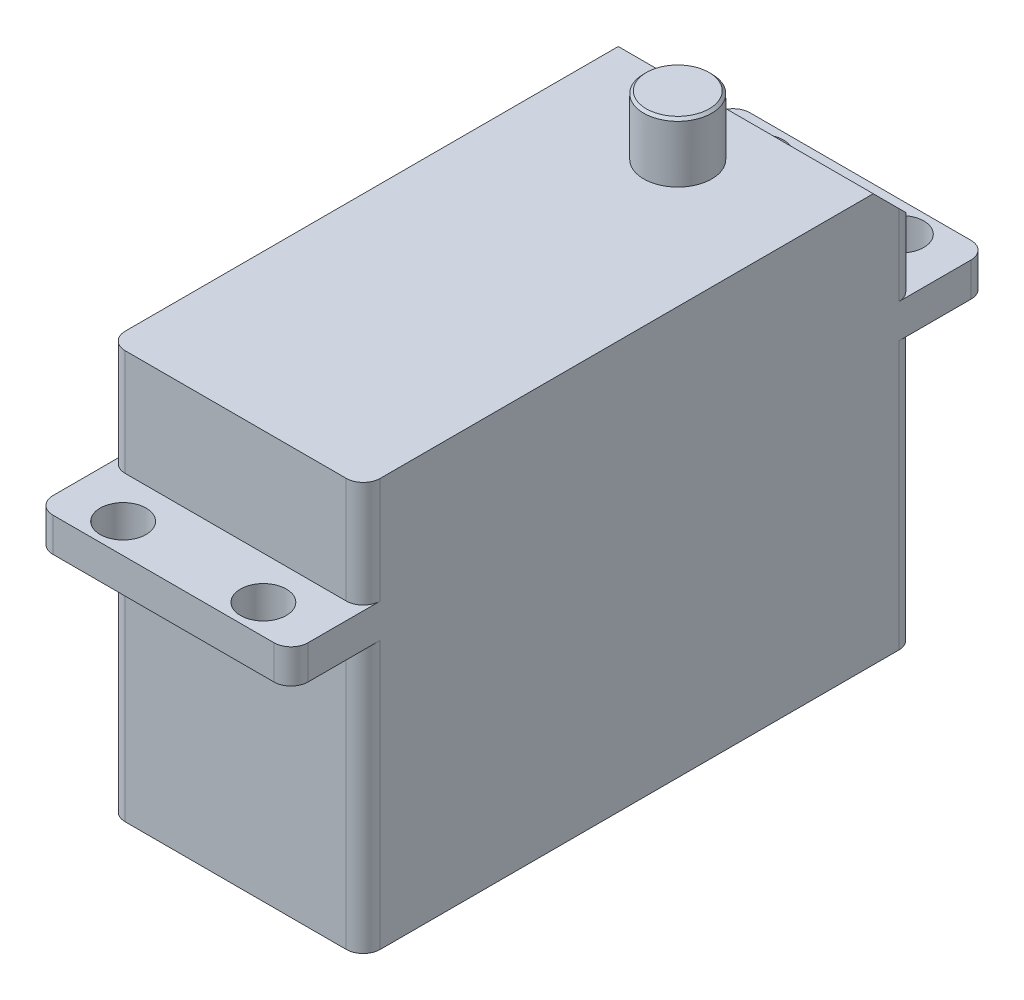
ISO-10303-21;
HEADER;
FILE_DESCRIPTION(('STEP AP214'),'2;1');
FILE_NAME('part.step','',(''),(''),'','','');
FILE_SCHEMA(('AUTOMOTIVE_DESIGN { 1 0 10303 214 1 1 1 1 }'));
ENDSEC;
DATA;
#1=APPLICATION_CONTEXT('core data for automotive mechanical design processes');
#2=APPLICATION_PROTOCOL_DEFINITION('international standard','automotive_design',2000,#1);
#3=PRODUCT_CONTEXT('',#1,'mechanical');
#4=PRODUCT('Part','Part','',(#3));
#5=PRODUCT_RELATED_PRODUCT_CATEGORY('part','',(#4));
#6=PRODUCT_DEFINITION_FORMATION('','',#4);
#7=PRODUCT_DEFINITION_CONTEXT('part definition',#1,'design');
#8=PRODUCT_DEFINITION('design','',#6,#7);
#9=PRODUCT_DEFINITION_SHAPE('','',#8);
#10=(LENGTH_UNIT() NAMED_UNIT(*) SI_UNIT(.MILLI.,.METRE.));
#11=(NAMED_UNIT(*) PLANE_ANGLE_UNIT() SI_UNIT($,.RADIAN.));
#12=(NAMED_UNIT(*) SI_UNIT($,.STERADIAN.) SOLID_ANGLE_UNIT());
#13=UNCERTAINTY_MEASURE_WITH_UNIT(LENGTH_MEASURE(1.E-05),#10,'distance_accuracy_value','');
#14=(GEOMETRIC_REPRESENTATION_CONTEXT(3) GLOBAL_UNCERTAINTY_ASSIGNED_CONTEXT((#13)) GLOBAL_UNIT_ASSIGNED_CONTEXT((#10,
#11,#12)) REPRESENTATION_CONTEXT('',''));
#15=CARTESIAN_POINT('',(0.,0.,0.));
#16=DIRECTION('',(0.,0.,1.));
#17=DIRECTION('',(1.,0.,0.));
#18=AXIS2_PLACEMENT_3D('',#15,#16,#17);
#19=CARTESIAN_POINT('',(-15.,48.,-32.5));
#20=DIRECTION('',(0.,0.,1.));
#21=DIRECTION('',(1.,0.,0.));
#22=AXIS2_PLACEMENT_3D('',#19,#20,#21);
#23=PLANE('',#22);
#24=DIRECTION('',(1.,0.,0.));
#25=VECTOR('',#24,1.);
#26=CARTESIAN_POINT('',(-15.,43.,-32.5));
#27=LINE('',#26,#25);
#28=CARTESIAN_POINT('',(-13.,43.,-32.5));
#29=VERTEX_POINT('',#28);
#30=CARTESIAN_POINT('',(13.,43.,-32.5));
#31=VERTEX_POINT('',#30);
#32=EDGE_CURVE('E287',#29,#31,#27,.T.);
#33=ORIENTED_EDGE('',*,*,#32,.T.);
#34=DIRECTION('',(0.,-1.,0.));
#35=VECTOR('',#34,1.);
#36=CARTESIAN_POINT('',(13.,48.,-32.5));
#37=LINE('',#36,#35);
#38=CARTESIAN_POINT('',(13.,35.5,-32.5));
#39=VERTEX_POINT('',#38);
#40=EDGE_CURVE('E332',#31,#39,#37,.T.);
#41=ORIENTED_EDGE('',*,*,#40,.T.);
#42=DIRECTION('',(1.,0.,0.));
#43=VECTOR('',#42,1.);
#44=CARTESIAN_POINT('',(-15.,35.5,-32.5));
#45=LINE('',#44,#43);
#46=CARTESIAN_POINT('',(-13.,35.5,-32.5));
#47=VERTEX_POINT('',#46);
#48=EDGE_CURVE('E345',#47,#39,#45,.T.);
#49=ORIENTED_EDGE('',*,*,#48,.F.);
#50=DIRECTION('',(0.,-1.,0.));
#51=VECTOR('',#50,1.);
#52=CARTESIAN_POINT('',(-13.,48.,-32.5));
#53=LINE('',#52,#51);
#54=EDGE_CURVE('E56',#47,#29,#53,.F.);
#55=ORIENTED_EDGE('',*,*,#54,.T.);
#56=EDGE_LOOP('',(#33,#41,#49,#55));
#57=FACE_BOUND('',#56,.T.);
#58=ADVANCED_FACE('F34',(#57),#23,.F.);
#59=CARTESIAN_POINT('',(-15.,48.,32.5));
#60=DIRECTION('',(0.,0.,-1.));
#61=DIRECTION('',(-1.,0.,0.));
#62=AXIS2_PLACEMENT_3D('',#59,#60,#61);
#63=PLANE('',#62);
#64=DIRECTION('',(-1.,0.,0.));
#65=VECTOR('',#64,1.);
#66=CARTESIAN_POINT('',(-15.,35.5,32.5));
#67=LINE('',#66,#65);
#68=CARTESIAN_POINT('',(13.,35.5,32.5));
#69=VERTEX_POINT('',#68);
#70=CARTESIAN_POINT('',(-13.,35.5,32.5));
#71=VERTEX_POINT('',#70);
#72=EDGE_CURVE('E358',#69,#71,#67,.T.);
#73=ORIENTED_EDGE('',*,*,#72,.F.);
#74=DIRECTION('',(0.,-1.,0.));
#75=VECTOR('',#74,1.);
#76=CARTESIAN_POINT('',(13.,48.,32.5));
#77=LINE('',#76,#75);
#78=CARTESIAN_POINT('',(13.,48.,32.5));
#79=VERTEX_POINT('',#78);
#80=EDGE_CURVE('E233',#69,#79,#77,.F.);
#81=ORIENTED_EDGE('',*,*,#80,.T.);
#82=DIRECTION('',(1.,0.,0.));
#83=VECTOR('',#82,1.);
#84=CARTESIAN_POINT('',(-15.,48.,32.5));
#85=LINE('',#84,#83);
#86=CARTESIAN_POINT('',(-13.,48.,32.5));
#87=VERTEX_POINT('',#86);
#88=EDGE_CURVE('E210',#87,#79,#85,.T.);
#89=ORIENTED_EDGE('',*,*,#88,.F.);
#90=DIRECTION('',(0.,-1.,0.));
#91=VECTOR('',#90,1.);
#92=CARTESIAN_POINT('',(-13.,48.,32.5));
#93=LINE('',#92,#91);
#94=EDGE_CURVE('E229',#87,#71,#93,.T.);
#95=ORIENTED_EDGE('',*,*,#94,.T.);
#96=EDGE_LOOP('',(#73,#81,#89,#95));
#97=FACE_BOUND('',#96,.T.);
#98=ADVANCED_FACE('F485',(#97),#63,.F.);
#99=CARTESIAN_POINT('',(15.,48.,32.5));
#100=DIRECTION('',(-1.,0.,0.));
#101=DIRECTION('',(0.,0.,1.));
#102=AXIS2_PLACEMENT_3D('',#99,#100,#101);
#103=PLANE('',#102);
#104=DIRECTION('',(0.,0.,1.));
#105=VECTOR('',#104,1.);
#106=CARTESIAN_POINT('',(15.,35.5,41.));
#107=LINE('',#106,#105);
#108=CARTESIAN_POINT('',(15.,35.5,30.5));
#109=VERTEX_POINT('',#108);
#110=CARTESIAN_POINT('',(15.,35.5,39.));
#111=VERTEX_POINT('',#110);
#112=EDGE_CURVE('E421',#109,#111,#107,.T.);
#113=ORIENTED_EDGE('',*,*,#112,.T.);
#114=DIRECTION('',(0.,1.,0.));
#115=VECTOR('',#114,1.);
#116=CARTESIAN_POINT('',(15.,48.,39.));
#117=LINE('',#116,#115);
#118=CARTESIAN_POINT('',(15.,31.5,39.));
#119=VERTEX_POINT('',#118);
#120=EDGE_CURVE('E316',#111,#119,#117,.F.);
#121=ORIENTED_EDGE('',*,*,#120,.T.);
#122=DIRECTION('',(0.,0.,1.));
#123=VECTOR('',#122,1.);
#124=CARTESIAN_POINT('',(15.,31.5,41.));
#125=LINE('',#124,#123);
#126=CARTESIAN_POINT('',(15.,31.5,30.5));
#127=VERTEX_POINT('',#126);
#128=EDGE_CURVE('E413',#127,#119,#125,.T.);
#129=ORIENTED_EDGE('',*,*,#128,.F.);
#130=DIRECTION('',(0.,-1.,0.));
#131=VECTOR('',#130,1.);
#132=CARTESIAN_POINT('',(15.,48.,30.5));
#133=LINE('',#132,#131);
#134=CARTESIAN_POINT('',(15.,0.,30.5));
#135=VERTEX_POINT('',#134);
#136=EDGE_CURVE('E230',#127,#135,#133,.T.);
#137=ORIENTED_EDGE('',*,*,#136,.T.);
#138=DIRECTION('',(0.,0.,-1.));
#139=VECTOR('',#138,1.);
#140=CARTESIAN_POINT('',(15.,0.,32.5));
#141=LINE('',#140,#139);
#142=CARTESIAN_POINT('',(15.,0.,-30.5));
#143=VERTEX_POINT('',#142);
#144=EDGE_CURVE('E362',#135,#143,#141,.T.);
#145=ORIENTED_EDGE('',*,*,#144,.T.);
#146=DIRECTION('',(0.,-1.,0.));
#147=VECTOR('',#146,1.);
#148=CARTESIAN_POINT('',(15.,48.,-30.5));
#149=LINE('',#148,#147);
#150=CARTESIAN_POINT('',(15.,31.5,-30.5));
#151=VERTEX_POINT('',#150);
#152=EDGE_CURVE('E236',#143,#151,#149,.F.);
#153=ORIENTED_EDGE('',*,*,#152,.T.);
#154=CARTESIAN_POINT('',(15.,31.5,-39.));
#155=VERTEX_POINT('',#154);
#156=EDGE_CURVE('E391',#155,#151,#125,.T.);
#157=ORIENTED_EDGE('',*,*,#156,.F.);
#158=DIRECTION('',(0.,1.,0.));
#159=VECTOR('',#158,1.);
#160=CARTESIAN_POINT('',(15.,48.,-39.));
#161=LINE('',#160,#159);
#162=CARTESIAN_POINT('',(15.,35.5,-39.));
#163=VERTEX_POINT('',#162);
#164=EDGE_CURVE('E313',#155,#163,#161,.T.);
#165=ORIENTED_EDGE('',*,*,#164,.T.);
#166=CARTESIAN_POINT('',(15.,35.5,-30.5));
#167=VERTEX_POINT('',#166);
#168=EDGE_CURVE('E344',#163,#167,#107,.T.);
#169=ORIENTED_EDGE('',*,*,#168,.T.);
#170=DIRECTION('',(0.,-1.,0.));
#171=VECTOR('',#170,1.);
#172=CARTESIAN_POINT('',(15.,48.,-30.5));
#173=LINE('',#172,#171);
#174=CARTESIAN_POINT('',(15.,45.,-30.5));
#175=VERTEX_POINT('',#174);
#176=EDGE_CURVE('E311',#167,#175,#173,.F.);
#177=ORIENTED_EDGE('',*,*,#176,.T.);
#178=DIRECTION('',(0.,-0.707106781186548,-0.707106781186547));
#179=VECTOR('',#178,1.);
#180=CARTESIAN_POINT('',(15.,48.,-27.5));
#181=LINE('',#180,#179);
#182=CARTESIAN_POINT('',(15.,48.,-27.5));
#183=VERTEX_POINT('',#182);
#184=EDGE_CURVE('E222',#175,#183,#181,.F.);
#185=ORIENTED_EDGE('',*,*,#184,.T.);
#186=DIRECTION('',(0.,0.,-1.));
#187=VECTOR('',#186,1.);
#188=CARTESIAN_POINT('',(15.,48.,32.5));
#189=LINE('',#188,#187);
#190=CARTESIAN_POINT('',(15.,48.,30.5));
#191=VERTEX_POINT('',#190);
#192=EDGE_CURVE('E207',#191,#183,#189,.T.);
#193=ORIENTED_EDGE('',*,*,#192,.F.);
#194=DIRECTION('',(0.,-1.,0.));
#195=VECTOR('',#194,1.);
#196=CARTESIAN_POINT('',(15.,48.,30.5));
#197=LINE('',#196,#195);
#198=EDGE_CURVE('E221',#191,#109,#197,.T.);
#199=ORIENTED_EDGE('',*,*,#198,.T.);
#200=EDGE_LOOP('',(#113,#121,#129,#137,#145,#153,#157,#165,#169,#177,#185,#193,#199));
#201=FACE_BOUND('',#200,.T.);
#202=ADVANCED_FACE('F220',(#201),#103,.F.);
#203=DIRECTION('',(1.,0.,0.));
#204=VECTOR('',#203,1.);
#205=CARTESIAN_POINT('',(-15.,31.5,-32.5));
#206=LINE('',#205,#204);
#207=CARTESIAN_POINT('',(-13.,31.5,-32.5));
#208=VERTEX_POINT('',#207);
#209=CARTESIAN_POINT('',(13.,31.5,-32.5));
#210=VERTEX_POINT('',#209);
#211=EDGE_CURVE('E366',#208,#210,#206,.T.);
#212=ORIENTED_EDGE('',*,*,#211,.T.);
#213=DIRECTION('',(0.,-1.,0.));
#214=VECTOR('',#213,1.);
#215=CARTESIAN_POINT('',(13.,48.,-32.5));
#216=LINE('',#215,#214);
#217=CARTESIAN_POINT('',(13.,0.,-32.5));
#218=VERTEX_POINT('',#217);
#219=EDGE_CURVE('E265',#210,#218,#216,.T.);
#220=ORIENTED_EDGE('',*,*,#219,.T.);
#221=DIRECTION('',(-1.,0.,0.));
#222=VECTOR('',#221,1.);
#223=CARTESIAN_POINT('',(-15.,0.,-32.5));
#224=LINE('',#223,#222);
#225=CARTESIAN_POINT('',(-13.,0.,-32.5));
#226=VERTEX_POINT('',#225);
#227=EDGE_CURVE('E365',#218,#226,#224,.T.);
#228=ORIENTED_EDGE('',*,*,#227,.T.);
#229=DIRECTION('',(0.,-1.,0.));
#230=VECTOR('',#229,1.);
#231=CARTESIAN_POINT('',(-13.,48.,-32.5));
#232=LINE('',#231,#230);
#233=EDGE_CURVE('E263',#226,#208,#232,.F.);
#234=ORIENTED_EDGE('',*,*,#233,.T.);
#235=EDGE_LOOP('',(#212,#220,#228,#234));
#236=FACE_BOUND('',#235,.T.);
#237=ADVANCED_FACE('F404',(#236),#23,.F.);
#238=CARTESIAN_POINT('',(-15.,48.,32.5));
#239=DIRECTION('',(1.,0.,0.));
#240=DIRECTION('',(0.,0.,-1.));
#241=AXIS2_PLACEMENT_3D('',#238,#239,#240);
#242=PLANE('',#241);
#243=DIRECTION('',(0.,0.,-1.));
#244=VECTOR('',#243,1.);
#245=CARTESIAN_POINT('',(-15.,31.5,41.));
#246=LINE('',#245,#244);
#247=CARTESIAN_POINT('',(-15.,31.5,39.));
#248=VERTEX_POINT('',#247);
#249=CARTESIAN_POINT('',(-15.,31.5,30.5));
#250=VERTEX_POINT('',#249);
#251=EDGE_CURVE('E424',#248,#250,#246,.T.);
#252=ORIENTED_EDGE('',*,*,#251,.F.);
#253=DIRECTION('',(0.,1.,0.));
#254=VECTOR('',#253,1.);
#255=CARTESIAN_POINT('',(-15.,48.,39.));
#256=LINE('',#255,#254);
#257=CARTESIAN_POINT('',(-15.,35.5,39.));
#258=VERTEX_POINT('',#257);
#259=EDGE_CURVE('E295',#248,#258,#256,.T.);
#260=ORIENTED_EDGE('',*,*,#259,.T.);
#261=DIRECTION('',(0.,0.,-1.));
#262=VECTOR('',#261,1.);
#263=CARTESIAN_POINT('',(-15.,35.5,41.));
#264=LINE('',#263,#262);
#265=CARTESIAN_POINT('',(-15.,35.5,30.5));
#266=VERTEX_POINT('',#265);
#267=EDGE_CURVE('E414',#258,#266,#264,.T.);
#268=ORIENTED_EDGE('',*,*,#267,.T.);
#269=DIRECTION('',(0.,-1.,0.));
#270=VECTOR('',#269,1.);
#271=CARTESIAN_POINT('',(-15.,48.,30.5));
#272=LINE('',#271,#270);
#273=CARTESIAN_POINT('',(-15.,48.,30.5));
#274=VERTEX_POINT('',#273);
#275=EDGE_CURVE('E247',#266,#274,#272,.F.);
#276=ORIENTED_EDGE('',*,*,#275,.T.);
#277=DIRECTION('',(0.,0.,1.));
#278=VECTOR('',#277,1.);
#279=CARTESIAN_POINT('',(-15.,48.,32.5));
#280=LINE('',#279,#278);
#281=CARTESIAN_POINT('',(-15.,48.,-27.5));
#282=VERTEX_POINT('',#281);
#283=EDGE_CURVE('E223',#282,#274,#280,.T.);
#284=ORIENTED_EDGE('',*,*,#283,.F.);
#285=DIRECTION('',(0.,0.707106781186548,0.707106781186547));
#286=VECTOR('',#285,1.);
#287=CARTESIAN_POINT('',(-15.,48.,-27.5));
#288=LINE('',#287,#286);
#289=CARTESIAN_POINT('',(-15.,45.,-30.5));
#290=VERTEX_POINT('',#289);
#291=EDGE_CURVE('E284',#282,#290,#288,.F.);
#292=ORIENTED_EDGE('',*,*,#291,.T.);
#293=DIRECTION('',(0.,-1.,0.));
#294=VECTOR('',#293,1.);
#295=CARTESIAN_POINT('',(-15.,48.,-30.5));
#296=LINE('',#295,#294);
#297=CARTESIAN_POINT('',(-15.,35.5,-30.5));
#298=VERTEX_POINT('',#297);
#299=EDGE_CURVE('E290',#290,#298,#296,.T.);
#300=ORIENTED_EDGE('',*,*,#299,.T.);
#301=CARTESIAN_POINT('',(-15.,35.5,-39.));
#302=VERTEX_POINT('',#301);
#303=EDGE_CURVE('E416',#298,#302,#264,.T.);
#304=ORIENTED_EDGE('',*,*,#303,.T.);
#305=DIRECTION('',(0.,1.,0.));
#306=VECTOR('',#305,1.);
#307=CARTESIAN_POINT('',(-15.,48.,-39.));
#308=LINE('',#307,#306);
#309=CARTESIAN_POINT('',(-15.,31.5,-39.));
#310=VERTEX_POINT('',#309);
#311=EDGE_CURVE('E293',#302,#310,#308,.F.);
#312=ORIENTED_EDGE('',*,*,#311,.T.);
#313=CARTESIAN_POINT('',(-15.,31.5,-30.5));
#314=VERTEX_POINT('',#313);
#315=EDGE_CURVE('E426',#314,#310,#246,.T.);
#316=ORIENTED_EDGE('',*,*,#315,.F.);
#317=DIRECTION('',(0.,-1.,0.));
#318=VECTOR('',#317,1.);
#319=CARTESIAN_POINT('',(-15.,48.,-30.5));
#320=LINE('',#319,#318);
#321=CARTESIAN_POINT('',(-15.,0.,-30.5));
#322=VERTEX_POINT('',#321);
#323=EDGE_CURVE('E214',#314,#322,#320,.T.);
#324=ORIENTED_EDGE('',*,*,#323,.T.);
#325=DIRECTION('',(0.,0.,1.));
#326=VECTOR('',#325,1.);
#327=CARTESIAN_POINT('',(-15.,0.,32.5));
#328=LINE('',#327,#326);
#329=CARTESIAN_POINT('',(-15.,0.,30.5));
#330=VERTEX_POINT('',#329);
#331=EDGE_CURVE('E369',#322,#330,#328,.T.);
#332=ORIENTED_EDGE('',*,*,#331,.T.);
#333=DIRECTION('',(0.,-1.,0.));
#334=VECTOR('',#333,1.);
#335=CARTESIAN_POINT('',(-15.,48.,30.5));
#336=LINE('',#335,#334);
#337=EDGE_CURVE('E244',#330,#250,#336,.F.);
#338=ORIENTED_EDGE('',*,*,#337,.T.);
#339=EDGE_LOOP('',(#252,#260,#268,#276,#284,#292,#300,#304,#312,#316,#324,#332,#338));
#340=FACE_BOUND('',#339,.T.);
#341=ADVANCED_FACE('F353',(#340),#242,.F.);
#342=DIRECTION('',(-1.,0.,0.));
#343=VECTOR('',#342,1.);
#344=CARTESIAN_POINT('',(-15.,31.5,32.5));
#345=LINE('',#344,#343);
#346=CARTESIAN_POINT('',(13.,31.5,32.5));
#347=VERTEX_POINT('',#346);
#348=CARTESIAN_POINT('',(-13.,31.5,32.5));
#349=VERTEX_POINT('',#348);
#350=EDGE_CURVE('E376',#347,#349,#345,.T.);
#351=ORIENTED_EDGE('',*,*,#350,.T.);
#352=DIRECTION('',(0.,-1.,0.));
#353=VECTOR('',#352,1.);
#354=CARTESIAN_POINT('',(-13.,48.,32.5));
#355=LINE('',#354,#353);
#356=CARTESIAN_POINT('',(-13.,0.,32.5));
#357=VERTEX_POINT('',#356);
#358=EDGE_CURVE('E252',#349,#357,#355,.T.);
#359=ORIENTED_EDGE('',*,*,#358,.T.);
#360=DIRECTION('',(1.,0.,0.));
#361=VECTOR('',#360,1.);
#362=CARTESIAN_POINT('',(-15.,0.,32.5));
#363=LINE('',#362,#361);
#364=CARTESIAN_POINT('',(13.,0.,32.5));
#365=VERTEX_POINT('',#364);
#366=EDGE_CURVE('E224',#357,#365,#363,.T.);
#367=ORIENTED_EDGE('',*,*,#366,.T.);
#368=DIRECTION('',(0.,-1.,0.));
#369=VECTOR('',#368,1.);
#370=CARTESIAN_POINT('',(13.,48.,32.5));
#371=LINE('',#370,#369);
#372=EDGE_CURVE('E250',#365,#347,#371,.F.);
#373=ORIENTED_EDGE('',*,*,#372,.T.);
#374=EDGE_LOOP('',(#351,#359,#367,#373));
#375=FACE_BOUND('',#374,.T.);
#376=ADVANCED_FACE('F492',(#375),#63,.F.);
#377=CARTESIAN_POINT('',(0.,48.,0.));
#378=DIRECTION('',(0.,-1.,0.));
#379=DIRECTION('',(0.,0.,-1.));
#380=AXIS2_PLACEMENT_3D('',#377,#378,#379);
#381=PLANE('',#380);
#382=CARTESIAN_POINT('',(0.,48.,-19.5));
#383=DIRECTION('',(0.,-1.,0.));
#384=DIRECTION('',(0.,0.,-1.));
#385=AXIS2_PLACEMENT_3D('',#382,#383,#384);
#386=CIRCLE('',#385,4.);
#387=CARTESIAN_POINT('',(0.,48.,-23.5));
#388=VERTEX_POINT('',#387);
#389=EDGE_CURVE('E379',#388,#388,#386,.F.);
#390=ORIENTED_EDGE('',*,*,#389,.F.);
#391=EDGE_LOOP('',(#390));
#392=FACE_BOUND('',#391,.T.);
#393=ORIENTED_EDGE('',*,*,#192,.T.);
#394=DIRECTION('',(-1.,0.,0.));
#395=VECTOR('',#394,1.);
#396=CARTESIAN_POINT('',(0.,48.,-27.5));
#397=LINE('',#396,#395);
#398=EDGE_CURVE('E282',#183,#282,#397,.T.);
#399=ORIENTED_EDGE('',*,*,#398,.T.);
#400=ORIENTED_EDGE('',*,*,#283,.T.);
#401=CARTESIAN_POINT('',(-13.,48.,30.5));
#402=DIRECTION('',(0.,-1.,0.));
#403=DIRECTION('',(0.,0.,-1.));
#404=AXIS2_PLACEMENT_3D('',#401,#402,#403);
#405=CIRCLE('',#404,2.);
#406=EDGE_CURVE('E215',#274,#87,#405,.F.);
#407=ORIENTED_EDGE('',*,*,#406,.T.);
#408=ORIENTED_EDGE('',*,*,#88,.T.);
#409=CARTESIAN_POINT('',(13.,48.,30.5));
#410=DIRECTION('',(0.,-1.,0.));
#411=DIRECTION('',(0.,0.,-1.));
#412=AXIS2_PLACEMENT_3D('',#409,#410,#411);
#413=CIRCLE('',#412,2.);
#414=EDGE_CURVE('E203',#79,#191,#413,.F.);
#415=ORIENTED_EDGE('',*,*,#414,.T.);
#416=EDGE_LOOP('',(#393,#399,#400,#407,#408,#415));
#417=FACE_BOUND('',#416,.T.);
#418=ADVANCED_FACE('F205',(#392,#417),#381,.F.);
#419=CARTESIAN_POINT('',(0.,0.,0.));
#420=DIRECTION('',(0.,-1.,0.));
#421=DIRECTION('',(0.,0.,-1.));
#422=AXIS2_PLACEMENT_3D('',#419,#420,#421);
#423=PLANE('',#422);
#424=ORIENTED_EDGE('',*,*,#366,.F.);
#425=CARTESIAN_POINT('',(-13.,0.,30.5));
#426=DIRECTION('',(0.,-1.,0.));
#427=DIRECTION('',(0.,0.,-1.));
#428=AXIS2_PLACEMENT_3D('',#425,#426,#427);
#429=CIRCLE('',#428,2.);
#430=EDGE_CURVE('E261',#357,#330,#429,.T.);
#431=ORIENTED_EDGE('',*,*,#430,.T.);
#432=ORIENTED_EDGE('',*,*,#331,.F.);
#433=CARTESIAN_POINT('',(-13.,0.,-30.5));
#434=DIRECTION('',(0.,-1.,0.));
#435=DIRECTION('',(0.,0.,-1.));
#436=AXIS2_PLACEMENT_3D('',#433,#434,#435);
#437=CIRCLE('',#436,2.);
#438=EDGE_CURVE('E255',#322,#226,#437,.T.);
#439=ORIENTED_EDGE('',*,*,#438,.T.);
#440=ORIENTED_EDGE('',*,*,#227,.F.);
#441=CARTESIAN_POINT('',(13.,0.,-30.5));
#442=DIRECTION('',(0.,-1.,0.));
#443=DIRECTION('',(0.,0.,-1.));
#444=AXIS2_PLACEMENT_3D('',#441,#442,#443);
#445=CIRCLE('',#444,2.);
#446=EDGE_CURVE('E257',#218,#143,#445,.T.);
#447=ORIENTED_EDGE('',*,*,#446,.T.);
#448=ORIENTED_EDGE('',*,*,#144,.F.);
#449=CARTESIAN_POINT('',(13.,0.,30.5));
#450=DIRECTION('',(0.,-1.,0.));
#451=DIRECTION('',(0.,0.,-1.));
#452=AXIS2_PLACEMENT_3D('',#449,#450,#451);
#453=CIRCLE('',#452,2.);
#454=EDGE_CURVE('E259',#135,#365,#453,.T.);
#455=ORIENTED_EDGE('',*,*,#454,.T.);
#456=EDGE_LOOP('',(#424,#431,#432,#439,#440,#447,#448,#455));
#457=FACE_BOUND('',#456,.T.);
#458=ADVANCED_FACE('F566',(#457),#423,.T.);
#459=CARTESIAN_POINT('',(-15.,31.5,41.));
#460=DIRECTION('',(0.,0.,-1.));
#461=DIRECTION('',(-1.,0.,0.));
#462=AXIS2_PLACEMENT_3D('',#459,#460,#461);
#463=PLANE('',#462);
#464=DIRECTION('',(-1.,0.,0.));
#465=VECTOR('',#464,1.);
#466=CARTESIAN_POINT('',(-15.,35.5,41.));
#467=LINE('',#466,#465);
#468=CARTESIAN_POINT('',(13.,35.5,41.));
#469=VERTEX_POINT('',#468);
#470=CARTESIAN_POINT('',(-13.,35.5,41.));
#471=VERTEX_POINT('',#470);
#472=EDGE_CURVE('E417',#469,#471,#467,.T.);
#473=ORIENTED_EDGE('',*,*,#472,.T.);
#474=DIRECTION('',(0.,1.,0.));
#475=VECTOR('',#474,1.);
#476=CARTESIAN_POINT('',(-13.,31.5,41.));
#477=LINE('',#476,#475);
#478=CARTESIAN_POINT('',(-13.,31.5,41.));
#479=VERTEX_POINT('',#478);
#480=EDGE_CURVE('E305',#471,#479,#477,.F.);
#481=ORIENTED_EDGE('',*,*,#480,.T.);
#482=DIRECTION('',(-1.,0.,0.));
#483=VECTOR('',#482,1.);
#484=CARTESIAN_POINT('',(-15.,31.5,41.));
#485=LINE('',#484,#483);
#486=CARTESIAN_POINT('',(13.,31.5,41.));
#487=VERTEX_POINT('',#486);
#488=EDGE_CURVE('E427',#487,#479,#485,.T.);
#489=ORIENTED_EDGE('',*,*,#488,.F.);
#490=DIRECTION('',(0.,1.,0.));
#491=VECTOR('',#490,1.);
#492=CARTESIAN_POINT('',(13.,31.5,41.));
#493=LINE('',#492,#491);
#494=EDGE_CURVE('E302',#487,#469,#493,.T.);
#495=ORIENTED_EDGE('',*,*,#494,.T.);
#496=EDGE_LOOP('',(#473,#481,#489,#495));
#497=FACE_BOUND('',#496,.T.);
#498=ADVANCED_FACE('F583',(#497),#463,.F.);
#499=CARTESIAN_POINT('',(0.,31.5,0.));
#500=DIRECTION('',(0.,-1.,0.));
#501=DIRECTION('',(0.,0.,-1.));
#502=AXIS2_PLACEMENT_3D('',#499,#500,#501);
#503=PLANE('',#502);
#504=CARTESIAN_POINT('',(-8.25,31.5,37.5));
#505=DIRECTION('',(0.,1.,0.));
#506=DIRECTION('',(0.,0.,1.));
#507=AXIS2_PLACEMENT_3D('',#504,#505,#506);
#508=CIRCLE('',#507,2.7);
#509=CARTESIAN_POINT('',(-8.25,31.5,40.2));
#510=VERTEX_POINT('',#509);
#511=EDGE_CURVE('E441',#510,#510,#508,.T.);
#512=ORIENTED_EDGE('',*,*,#511,.T.);
#513=EDGE_LOOP('',(#512));
#514=FACE_BOUND('',#513,.T.);
#515=CARTESIAN_POINT('',(8.25,31.5,37.5));
#516=DIRECTION('',(0.,1.,0.));
#517=DIRECTION('',(0.,0.,1.));
#518=AXIS2_PLACEMENT_3D('',#515,#516,#517);
#519=CIRCLE('',#518,2.7);
#520=CARTESIAN_POINT('',(8.25,31.5,40.2));
#521=VERTEX_POINT('',#520);
#522=EDGE_CURVE('E447',#521,#521,#519,.T.);
#523=ORIENTED_EDGE('',*,*,#522,.T.);
#524=EDGE_LOOP('',(#523));
#525=FACE_BOUND('',#524,.T.);
#526=ORIENTED_EDGE('',*,*,#488,.T.);
#527=CARTESIAN_POINT('',(-13.,31.5,39.));
#528=DIRECTION('',(0.,-1.,0.));
#529=DIRECTION('',(0.,0.,-1.));
#530=AXIS2_PLACEMENT_3D('',#527,#528,#529);
#531=CIRCLE('',#530,2.);
#532=EDGE_CURVE('E309',#479,#248,#531,.T.);
#533=ORIENTED_EDGE('',*,*,#532,.T.);
#534=ORIENTED_EDGE('',*,*,#251,.T.);
#535=CARTESIAN_POINT('',(-13.,31.5,30.5));
#536=DIRECTION('',(0.,-1.,0.));
#537=DIRECTION('',(0.,0.,-1.));
#538=AXIS2_PLACEMENT_3D('',#535,#536,#537);
#539=CIRCLE('',#538,2.);
#540=EDGE_CURVE('E272',#250,#349,#539,.F.);
#541=ORIENTED_EDGE('',*,*,#540,.T.);
#542=ORIENTED_EDGE('',*,*,#350,.F.);
#543=CARTESIAN_POINT('',(13.,31.5,30.5));
#544=DIRECTION('',(0.,-1.,0.));
#545=DIRECTION('',(0.,0.,-1.));
#546=AXIS2_PLACEMENT_3D('',#543,#544,#545);
#547=CIRCLE('',#546,2.);
#548=EDGE_CURVE('E274',#347,#127,#547,.F.);
#549=ORIENTED_EDGE('',*,*,#548,.T.);
#550=ORIENTED_EDGE('',*,*,#128,.T.);
#551=CARTESIAN_POINT('',(13.,31.5,39.));
#552=DIRECTION('',(0.,-1.,0.));
#553=DIRECTION('',(0.,0.,-1.));
#554=AXIS2_PLACEMENT_3D('',#551,#552,#553);
#555=CIRCLE('',#554,2.);
#556=EDGE_CURVE('E307',#119,#487,#555,.T.);
#557=ORIENTED_EDGE('',*,*,#556,.T.);
#558=EDGE_LOOP('',(#526,#533,#534,#541,#542,#549,#550,#557));
#559=FACE_BOUND('',#558,.T.);
#560=ADVANCED_FACE('F574',(#514,#525,#559),#503,.T.);
#561=CARTESIAN_POINT('',(0.,35.5,0.));
#562=DIRECTION('',(0.,-1.,0.));
#563=DIRECTION('',(0.,0.,-1.));
#564=AXIS2_PLACEMENT_3D('',#561,#562,#563);
#565=PLANE('',#564);
#566=CARTESIAN_POINT('',(-8.25,35.5,37.5));
#567=DIRECTION('',(0.,1.,0.));
#568=DIRECTION('',(0.,0.,1.));
#569=AXIS2_PLACEMENT_3D('',#566,#567,#568);
#570=CIRCLE('',#569,2.7);
#571=CARTESIAN_POINT('',(-8.25,35.5,40.2));
#572=VERTEX_POINT('',#571);
#573=EDGE_CURVE('E438',#572,#572,#570,.T.);
#574=ORIENTED_EDGE('',*,*,#573,.F.);
#575=EDGE_LOOP('',(#574));
#576=FACE_BOUND('',#575,.T.);
#577=CARTESIAN_POINT('',(8.25,35.5,37.5));
#578=DIRECTION('',(0.,1.,0.));
#579=DIRECTION('',(0.,0.,1.));
#580=AXIS2_PLACEMENT_3D('',#577,#578,#579);
#581=CIRCLE('',#580,2.7);
#582=CARTESIAN_POINT('',(8.25,35.5,40.2));
#583=VERTEX_POINT('',#582);
#584=EDGE_CURVE('E444',#583,#583,#581,.T.);
#585=ORIENTED_EDGE('',*,*,#584,.F.);
#586=EDGE_LOOP('',(#585));
#587=FACE_BOUND('',#586,.T.);
#588=ORIENTED_EDGE('',*,*,#267,.F.);
#589=CARTESIAN_POINT('',(-13.,35.5,39.));
#590=DIRECTION('',(0.,-1.,0.));
#591=DIRECTION('',(0.,0.,-1.));
#592=AXIS2_PLACEMENT_3D('',#589,#590,#591);
#593=CIRCLE('',#592,2.);
#594=EDGE_CURVE('E300',#258,#471,#593,.F.);
#595=ORIENTED_EDGE('',*,*,#594,.T.);
#596=ORIENTED_EDGE('',*,*,#472,.F.);
#597=CARTESIAN_POINT('',(13.,35.5,39.));
#598=DIRECTION('',(0.,-1.,0.));
#599=DIRECTION('',(0.,0.,-1.));
#600=AXIS2_PLACEMENT_3D('',#597,#598,#599);
#601=CIRCLE('',#600,2.);
#602=EDGE_CURVE('E298',#469,#111,#601,.F.);
#603=ORIENTED_EDGE('',*,*,#602,.T.);
#604=ORIENTED_EDGE('',*,*,#112,.F.);
#605=CARTESIAN_POINT('',(13.,35.5,30.5));
#606=DIRECTION('',(0.,-1.,0.));
#607=DIRECTION('',(0.,0.,-1.));
#608=AXIS2_PLACEMENT_3D('',#605,#606,#607);
#609=CIRCLE('',#608,2.);
#610=EDGE_CURVE('E228',#109,#69,#609,.T.);
#611=ORIENTED_EDGE('',*,*,#610,.T.);
#612=ORIENTED_EDGE('',*,*,#72,.T.);
#613=CARTESIAN_POINT('',(-13.,35.5,30.5));
#614=DIRECTION('',(0.,-1.,0.));
#615=DIRECTION('',(0.,0.,-1.));
#616=AXIS2_PLACEMENT_3D('',#613,#614,#615);
#617=CIRCLE('',#616,2.);
#618=EDGE_CURVE('E269',#71,#266,#617,.T.);
#619=ORIENTED_EDGE('',*,*,#618,.T.);
#620=EDGE_LOOP('',(#588,#595,#596,#603,#604,#611,#612,#619));
#621=FACE_BOUND('',#620,.T.);
#622=ADVANCED_FACE('F470',(#576,#587,#621),#565,.F.);
#623=CARTESIAN_POINT('',(8.25,31.5,-37.5));
#624=DIRECTION('',(0.,1.,0.));
#625=DIRECTION('',(0.,0.,1.));
#626=AXIS2_PLACEMENT_3D('',#623,#624,#625);
#627=CIRCLE('',#626,2.7);
#628=CARTESIAN_POINT('',(8.25,31.5,-34.8));
#629=VERTEX_POINT('',#628);
#630=EDGE_CURVE('E435',#629,#629,#627,.T.);
#631=ORIENTED_EDGE('',*,*,#630,.T.);
#632=EDGE_LOOP('',(#631));
#633=FACE_BOUND('',#632,.T.);
#634=CARTESIAN_POINT('',(-8.25,31.5,-37.5));
#635=DIRECTION('',(0.,1.,0.));
#636=DIRECTION('',(0.,0.,1.));
#637=AXIS2_PLACEMENT_3D('',#634,#635,#636);
#638=CIRCLE('',#637,2.7);
#639=CARTESIAN_POINT('',(-8.25,31.5,-34.8));
#640=VERTEX_POINT('',#639);
#641=EDGE_CURVE('E434',#640,#640,#638,.T.);
#642=ORIENTED_EDGE('',*,*,#641,.T.);
#643=EDGE_LOOP('',(#642));
#644=FACE_BOUND('',#643,.T.);
#645=ORIENTED_EDGE('',*,*,#315,.T.);
#646=CARTESIAN_POINT('',(-13.,31.5,-39.));
#647=DIRECTION('',(0.,-1.,0.));
#648=DIRECTION('',(0.,0.,-1.));
#649=AXIS2_PLACEMENT_3D('',#646,#647,#648);
#650=CIRCLE('',#649,2.);
#651=CARTESIAN_POINT('',(-13.,31.5,-41.));
#652=VERTEX_POINT('',#651);
#653=EDGE_CURVE('E329',#310,#652,#650,.T.);
#654=ORIENTED_EDGE('',*,*,#653,.T.);
#655=DIRECTION('',(1.,0.,0.));
#656=VECTOR('',#655,1.);
#657=CARTESIAN_POINT('',(-15.,31.5,-41.));
#658=LINE('',#657,#656);
#659=CARTESIAN_POINT('',(13.,31.5,-41.));
#660=VERTEX_POINT('',#659);
#661=EDGE_CURVE('E407',#652,#660,#658,.T.);
#662=ORIENTED_EDGE('',*,*,#661,.T.);
#663=CARTESIAN_POINT('',(13.,31.5,-39.));
#664=DIRECTION('',(0.,-1.,0.));
#665=DIRECTION('',(0.,0.,-1.));
#666=AXIS2_PLACEMENT_3D('',#663,#664,#665);
#667=CIRCLE('',#666,2.);
#668=EDGE_CURVE('E327',#660,#155,#667,.T.);
#669=ORIENTED_EDGE('',*,*,#668,.T.);
#670=ORIENTED_EDGE('',*,*,#156,.T.);
#671=CARTESIAN_POINT('',(13.,31.5,-30.5));
#672=DIRECTION('',(0.,-1.,0.));
#673=DIRECTION('',(0.,0.,-1.));
#674=AXIS2_PLACEMENT_3D('',#671,#672,#673);
#675=CIRCLE('',#674,2.);
#676=EDGE_CURVE('E277',#151,#210,#675,.F.);
#677=ORIENTED_EDGE('',*,*,#676,.T.);
#678=ORIENTED_EDGE('',*,*,#211,.F.);
#679=CARTESIAN_POINT('',(-13.,31.5,-30.5));
#680=DIRECTION('',(0.,-1.,0.));
#681=DIRECTION('',(0.,0.,-1.));
#682=AXIS2_PLACEMENT_3D('',#679,#680,#681);
#683=CIRCLE('',#682,2.);
#684=EDGE_CURVE('E279',#208,#314,#683,.F.);
#685=ORIENTED_EDGE('',*,*,#684,.T.);
#686=EDGE_LOOP('',(#645,#654,#662,#669,#670,#677,#678,#685));
#687=FACE_BOUND('',#686,.T.);
#688=ADVANCED_FACE('F401',(#633,#644,#687),#503,.T.);
#689=CARTESIAN_POINT('',(8.25,35.5,-37.5));
#690=DIRECTION('',(0.,1.,0.));
#691=DIRECTION('',(0.,0.,1.));
#692=AXIS2_PLACEMENT_3D('',#689,#690,#691);
#693=CIRCLE('',#692,2.7);
#694=CARTESIAN_POINT('',(8.25,35.5,-34.8));
#695=VERTEX_POINT('',#694);
#696=EDGE_CURVE('E450',#695,#695,#693,.T.);
#697=ORIENTED_EDGE('',*,*,#696,.F.);
#698=EDGE_LOOP('',(#697));
#699=FACE_BOUND('',#698,.T.);
#700=CARTESIAN_POINT('',(-8.25,35.5,-37.5));
#701=DIRECTION('',(0.,1.,0.));
#702=DIRECTION('',(0.,0.,1.));
#703=AXIS2_PLACEMENT_3D('',#700,#701,#702);
#704=CIRCLE('',#703,2.7);
#705=CARTESIAN_POINT('',(-8.25,35.5,-34.8));
#706=VERTEX_POINT('',#705);
#707=EDGE_CURVE('E431',#706,#706,#704,.T.);
#708=ORIENTED_EDGE('',*,*,#707,.F.);
#709=EDGE_LOOP('',(#708));
#710=FACE_BOUND('',#709,.T.);
#711=DIRECTION('',(1.,0.,0.));
#712=VECTOR('',#711,1.);
#713=CARTESIAN_POINT('',(-15.,35.5,-41.));
#714=LINE('',#713,#712);
#715=CARTESIAN_POINT('',(-13.,35.5,-41.));
#716=VERTEX_POINT('',#715);
#717=CARTESIAN_POINT('',(13.,35.5,-41.));
#718=VERTEX_POINT('',#717);
#719=EDGE_CURVE('E410',#716,#718,#714,.T.);
#720=ORIENTED_EDGE('',*,*,#719,.F.);
#721=CARTESIAN_POINT('',(-13.,35.5,-39.));
#722=DIRECTION('',(0.,-1.,0.));
#723=DIRECTION('',(0.,0.,-1.));
#724=AXIS2_PLACEMENT_3D('',#721,#722,#723);
#725=CIRCLE('',#724,2.);
#726=EDGE_CURVE('E325',#716,#302,#725,.F.);
#727=ORIENTED_EDGE('',*,*,#726,.T.);
#728=ORIENTED_EDGE('',*,*,#303,.F.);
#729=CARTESIAN_POINT('',(-13.,35.5,-30.5));
#730=DIRECTION('',(0.,-1.,0.));
#731=DIRECTION('',(0.,0.,-1.));
#732=AXIS2_PLACEMENT_3D('',#729,#730,#731);
#733=CIRCLE('',#732,2.);
#734=EDGE_CURVE('E11',#298,#47,#733,.T.);
#735=ORIENTED_EDGE('',*,*,#734,.T.);
#736=ORIENTED_EDGE('',*,*,#48,.T.);
#737=CARTESIAN_POINT('',(13.,35.5,-30.5));
#738=DIRECTION('',(0.,-1.,0.));
#739=DIRECTION('',(0.,0.,-1.));
#740=AXIS2_PLACEMENT_3D('',#737,#738,#739);
#741=CIRCLE('',#740,2.);
#742=EDGE_CURVE('E42',#39,#167,#741,.T.);
#743=ORIENTED_EDGE('',*,*,#742,.T.);
#744=ORIENTED_EDGE('',*,*,#168,.F.);
#745=CARTESIAN_POINT('',(13.,35.5,-39.));
#746=DIRECTION('',(0.,-1.,0.));
#747=DIRECTION('',(0.,0.,-1.));
#748=AXIS2_PLACEMENT_3D('',#745,#746,#747);
#749=CIRCLE('',#748,2.);
#750=EDGE_CURVE('E323',#163,#718,#749,.F.);
#751=ORIENTED_EDGE('',*,*,#750,.T.);
#752=EDGE_LOOP('',(#720,#727,#728,#735,#736,#743,#744,#751));
#753=FACE_BOUND('',#752,.T.);
#754=ADVANCED_FACE('F343',(#699,#710,#753),#565,.F.);
#755=CARTESIAN_POINT('',(-15.,31.5,-41.));
#756=DIRECTION('',(0.,0.,1.));
#757=DIRECTION('',(1.,0.,0.));
#758=AXIS2_PLACEMENT_3D('',#755,#756,#757);
#759=PLANE('',#758);
#760=ORIENTED_EDGE('',*,*,#661,.F.);
#761=DIRECTION('',(0.,1.,0.));
#762=VECTOR('',#761,1.);
#763=CARTESIAN_POINT('',(-13.,31.5,-41.));
#764=LINE('',#763,#762);
#765=EDGE_CURVE('E320',#652,#716,#764,.T.);
#766=ORIENTED_EDGE('',*,*,#765,.T.);
#767=ORIENTED_EDGE('',*,*,#719,.T.);
#768=DIRECTION('',(0.,1.,0.));
#769=VECTOR('',#768,1.);
#770=CARTESIAN_POINT('',(13.,31.5,-41.));
#771=LINE('',#770,#769);
#772=EDGE_CURVE('E318',#718,#660,#771,.F.);
#773=ORIENTED_EDGE('',*,*,#772,.T.);
#774=EDGE_LOOP('',(#760,#766,#767,#773));
#775=FACE_BOUND('',#774,.T.);
#776=ADVANCED_FACE('F468',(#775),#759,.F.);
#777=CARTESIAN_POINT('',(-8.25,31.5,-37.5));
#778=DIRECTION('',(0.,1.,0.));
#779=DIRECTION('',(0.,0.,1.));
#780=AXIS2_PLACEMENT_3D('',#777,#778,#779);
#781=CYLINDRICAL_SURFACE('',#780,2.7);
#782=ORIENTED_EDGE('',*,*,#641,.F.);
#783=EDGE_LOOP('',(#782));
#784=FACE_BOUND('',#783,.T.);
#785=ORIENTED_EDGE('',*,*,#707,.T.);
#786=EDGE_LOOP('',(#785));
#787=FACE_BOUND('',#786,.T.);
#788=ADVANCED_FACE('F462',(#784,#787),#781,.F.);
#789=CARTESIAN_POINT('',(8.25,31.5,-37.5));
#790=DIRECTION('',(0.,1.,0.));
#791=DIRECTION('',(0.,0.,1.));
#792=AXIS2_PLACEMENT_3D('',#789,#790,#791);
#793=CYLINDRICAL_SURFACE('',#792,2.7);
#794=ORIENTED_EDGE('',*,*,#630,.F.);
#795=EDGE_LOOP('',(#794));
#796=FACE_BOUND('',#795,.T.);
#797=ORIENTED_EDGE('',*,*,#696,.T.);
#798=EDGE_LOOP('',(#797));
#799=FACE_BOUND('',#798,.T.);
#800=ADVANCED_FACE('F458',(#796,#799),#793,.F.);
#801=CARTESIAN_POINT('',(8.25,31.5,37.5));
#802=DIRECTION('',(0.,1.,0.));
#803=DIRECTION('',(0.,0.,1.));
#804=AXIS2_PLACEMENT_3D('',#801,#802,#803);
#805=CYLINDRICAL_SURFACE('',#804,2.7);
#806=ORIENTED_EDGE('',*,*,#522,.F.);
#807=EDGE_LOOP('',(#806));
#808=FACE_BOUND('',#807,.T.);
#809=ORIENTED_EDGE('',*,*,#584,.T.);
#810=EDGE_LOOP('',(#809));
#811=FACE_BOUND('',#810,.T.);
#812=ADVANCED_FACE('F461',(#808,#811),#805,.F.);
#813=CARTESIAN_POINT('',(-8.25,31.5,37.5));
#814=DIRECTION('',(0.,1.,0.));
#815=DIRECTION('',(0.,0.,1.));
#816=AXIS2_PLACEMENT_3D('',#813,#814,#815);
#817=CYLINDRICAL_SURFACE('',#816,2.7);
#818=ORIENTED_EDGE('',*,*,#511,.F.);
#819=EDGE_LOOP('',(#818));
#820=FACE_BOUND('',#819,.T.);
#821=ORIENTED_EDGE('',*,*,#573,.T.);
#822=EDGE_LOOP('',(#821));
#823=FACE_BOUND('',#822,.T.);
#824=ADVANCED_FACE('F734',(#820,#823),#817,.F.);
#825=CARTESIAN_POINT('',(0.,55.,-19.5));
#826=DIRECTION('',(0.,-1.,0.));
#827=DIRECTION('',(0.,0.,-1.));
#828=AXIS2_PLACEMENT_3D('',#825,#826,#827);
#829=CYLINDRICAL_SURFACE('',#828,4.);
#830=CARTESIAN_POINT('',(0.,54.7,-19.5));
#831=DIRECTION('',(0.,1.,0.));
#832=DIRECTION('',(0.,0.,1.));
#833=AXIS2_PLACEMENT_3D('',#830,#831,#832);
#834=CIRCLE('',#833,4.);
#835=CARTESIAN_POINT('',(0.,54.7,-15.5));
#836=VERTEX_POINT('',#835);
#837=EDGE_CURVE('E385',#836,#836,#834,.F.);
#838=ORIENTED_EDGE('',*,*,#837,.T.);
#839=EDGE_LOOP('',(#838));
#840=FACE_BOUND('',#839,.T.);
#841=ORIENTED_EDGE('',*,*,#389,.T.);
#842=EDGE_LOOP('',(#841));
#843=FACE_BOUND('',#842,.T.);
#844=ADVANCED_FACE('F726',(#840,#843),#829,.T.);
#845=CARTESIAN_POINT('',(0.,55.,-19.5));
#846=DIRECTION('',(0.,1.,0.));
#847=DIRECTION('',(0.,0.,1.));
#848=AXIS2_PLACEMENT_3D('',#845,#846,#847);
#849=PLANE('',#848);
#850=CARTESIAN_POINT('',(0.,55.,-19.5));
#851=DIRECTION('',(0.,1.,0.));
#852=DIRECTION('',(0.,0.,1.));
#853=AXIS2_PLACEMENT_3D('',#850,#851,#852);
#854=CIRCLE('',#853,3.69999999999997);
#855=CARTESIAN_POINT('',(0.,55.,-15.8));
#856=VERTEX_POINT('',#855);
#857=EDGE_CURVE('E382',#856,#856,#854,.T.);
#858=ORIENTED_EDGE('',*,*,#857,.T.);
#859=EDGE_LOOP('',(#858));
#860=FACE_BOUND('',#859,.T.);
#861=ADVANCED_FACE('F506',(#860),#849,.T.);
#862=CARTESIAN_POINT('',(0.,55.,-19.5));
#863=DIRECTION('',(0.,-1.,0.));
#864=DIRECTION('',(0.,0.,-1.));
#865=AXIS2_PLACEMENT_3D('',#862,#863,#864);
#866=CONICAL_SURFACE('',#865,3.69999999999997,0.785398163397466);
#867=ORIENTED_EDGE('',*,*,#837,.F.);
#868=EDGE_LOOP('',(#867));
#869=FACE_BOUND('',#868,.T.);
#870=ORIENTED_EDGE('',*,*,#857,.F.);
#871=EDGE_LOOP('',(#870));
#872=FACE_BOUND('',#871,.T.);
#873=ADVANCED_FACE('F503',(#869,#872),#866,.T.);
#874=CARTESIAN_POINT('',(13.,48.,30.5));
#875=DIRECTION('',(0.,-1.,0.));
#876=DIRECTION('',(0.,0.,-1.));
#877=AXIS2_PLACEMENT_3D('',#874,#875,#876);
#878=CYLINDRICAL_SURFACE('',#877,2.);
#879=ORIENTED_EDGE('',*,*,#414,.F.);
#880=ORIENTED_EDGE('',*,*,#80,.F.);
#881=ORIENTED_EDGE('',*,*,#610,.F.);
#882=ORIENTED_EDGE('',*,*,#198,.F.);
#883=EDGE_LOOP('',(#879,#880,#881,#882));
#884=FACE_BOUND('',#883,.T.);
#885=ADVANCED_FACE('F227',(#884),#878,.T.);
#886=CARTESIAN_POINT('',(-13.,48.,30.5));
#887=DIRECTION('',(0.,-1.,0.));
#888=DIRECTION('',(0.,0.,-1.));
#889=AXIS2_PLACEMENT_3D('',#886,#887,#888);
#890=CYLINDRICAL_SURFACE('',#889,2.);
#891=ORIENTED_EDGE('',*,*,#406,.F.);
#892=ORIENTED_EDGE('',*,*,#275,.F.);
#893=ORIENTED_EDGE('',*,*,#618,.F.);
#894=ORIENTED_EDGE('',*,*,#94,.F.);
#895=EDGE_LOOP('',(#891,#892,#893,#894));
#896=FACE_BOUND('',#895,.T.);
#897=ADVANCED_FACE('F510',(#896),#890,.T.);
#898=CARTESIAN_POINT('',(-13.,48.,30.5));
#899=DIRECTION('',(0.,-1.,0.));
#900=DIRECTION('',(0.,0.,-1.));
#901=AXIS2_PLACEMENT_3D('',#898,#899,#900);
#902=CYLINDRICAL_SURFACE('',#901,2.);
#903=ORIENTED_EDGE('',*,*,#540,.F.);
#904=ORIENTED_EDGE('',*,*,#337,.F.);
#905=ORIENTED_EDGE('',*,*,#430,.F.);
#906=ORIENTED_EDGE('',*,*,#358,.F.);
#907=EDGE_LOOP('',(#903,#904,#905,#906));
#908=FACE_BOUND('',#907,.T.);
#909=ADVANCED_FACE('F513',(#908),#902,.T.);
#910=CARTESIAN_POINT('',(13.,48.,30.5));
#911=DIRECTION('',(0.,-1.,0.));
#912=DIRECTION('',(0.,0.,-1.));
#913=AXIS2_PLACEMENT_3D('',#910,#911,#912);
#914=CYLINDRICAL_SURFACE('',#913,2.);
#915=ORIENTED_EDGE('',*,*,#548,.F.);
#916=ORIENTED_EDGE('',*,*,#372,.F.);
#917=ORIENTED_EDGE('',*,*,#454,.F.);
#918=ORIENTED_EDGE('',*,*,#136,.F.);
#919=EDGE_LOOP('',(#915,#916,#917,#918));
#920=FACE_BOUND('',#919,.T.);
#921=ADVANCED_FACE('F517',(#920),#914,.T.);
#922=CARTESIAN_POINT('',(13.,48.,-30.5));
#923=DIRECTION('',(0.,-1.,0.));
#924=DIRECTION('',(0.,0.,-1.));
#925=AXIS2_PLACEMENT_3D('',#922,#923,#924);
#926=CYLINDRICAL_SURFACE('',#925,2.);
#927=ORIENTED_EDGE('',*,*,#676,.F.);
#928=ORIENTED_EDGE('',*,*,#152,.F.);
#929=ORIENTED_EDGE('',*,*,#446,.F.);
#930=ORIENTED_EDGE('',*,*,#219,.F.);
#931=EDGE_LOOP('',(#927,#928,#929,#930));
#932=FACE_BOUND('',#931,.T.);
#933=ADVANCED_FACE('F396',(#932),#926,.T.);
#934=CARTESIAN_POINT('',(-13.,48.,-30.5));
#935=DIRECTION('',(0.,-1.,0.));
#936=DIRECTION('',(0.,0.,-1.));
#937=AXIS2_PLACEMENT_3D('',#934,#935,#936);
#938=CYLINDRICAL_SURFACE('',#937,2.);
#939=ORIENTED_EDGE('',*,*,#684,.F.);
#940=ORIENTED_EDGE('',*,*,#233,.F.);
#941=ORIENTED_EDGE('',*,*,#438,.F.);
#942=ORIENTED_EDGE('',*,*,#323,.F.);
#943=EDGE_LOOP('',(#939,#940,#941,#942));
#944=FACE_BOUND('',#943,.T.);
#945=ADVANCED_FACE('F524',(#944),#938,.T.);
#946=CARTESIAN_POINT('',(0.,48.,-27.5));
#947=DIRECTION('',(0.,-0.707106781186547,0.707106781186548));
#948=DIRECTION('',(-1.,0.,0.));
#949=AXIS2_PLACEMENT_3D('',#946,#947,#948);
#950=PLANE('',#949);
#951=ORIENTED_EDGE('',*,*,#184,.F.);
#952=CARTESIAN_POINT('',(13.,45.,-30.5));
#953=DIRECTION('',(0.,-0.707106781186547,0.707106781186548));
#954=DIRECTION('',(0.,-0.707106781186548,-0.707106781186547));
#955=AXIS2_PLACEMENT_3D('',#952,#953,#954);
#956=ELLIPSE('',#955,2.82842712474619,2.);
#957=EDGE_CURVE('E49',#175,#31,#956,.F.);
#958=ORIENTED_EDGE('',*,*,#957,.T.);
#959=ORIENTED_EDGE('',*,*,#32,.F.);
#960=CARTESIAN_POINT('',(-13.,45.,-30.5));
#961=DIRECTION('',(0.,-0.707106781186547,0.707106781186548));
#962=DIRECTION('',(0.,-0.707106781186548,-0.707106781186547));
#963=AXIS2_PLACEMENT_3D('',#960,#961,#962);
#964=ELLIPSE('',#963,2.82842712474619,2.);
#965=EDGE_CURVE('E335',#29,#290,#964,.F.);
#966=ORIENTED_EDGE('',*,*,#965,.T.);
#967=ORIENTED_EDGE('',*,*,#291,.F.);
#968=ORIENTED_EDGE('',*,*,#398,.F.);
#969=EDGE_LOOP('',(#951,#958,#959,#966,#967,#968));
#970=FACE_BOUND('',#969,.T.);
#971=ADVANCED_FACE('F349',(#970),#950,.F.);
#972=CARTESIAN_POINT('',(-13.,48.,39.));
#973=DIRECTION('',(0.,1.,0.));
#974=DIRECTION('',(0.,0.,1.));
#975=AXIS2_PLACEMENT_3D('',#972,#973,#974);
#976=CYLINDRICAL_SURFACE('',#975,2.);
#977=ORIENTED_EDGE('',*,*,#532,.F.);
#978=ORIENTED_EDGE('',*,*,#480,.F.);
#979=ORIENTED_EDGE('',*,*,#594,.F.);
#980=ORIENTED_EDGE('',*,*,#259,.F.);
#981=EDGE_LOOP('',(#977,#978,#979,#980));
#982=FACE_BOUND('',#981,.T.);
#983=ADVANCED_FACE('F530',(#982),#976,.T.);
#984=CARTESIAN_POINT('',(13.,31.5,39.));
#985=DIRECTION('',(0.,1.,0.));
#986=DIRECTION('',(0.,0.,1.));
#987=AXIS2_PLACEMENT_3D('',#984,#985,#986);
#988=CYLINDRICAL_SURFACE('',#987,2.);
#989=ORIENTED_EDGE('',*,*,#556,.F.);
#990=ORIENTED_EDGE('',*,*,#120,.F.);
#991=ORIENTED_EDGE('',*,*,#602,.F.);
#992=ORIENTED_EDGE('',*,*,#494,.F.);
#993=EDGE_LOOP('',(#989,#990,#991,#992));
#994=FACE_BOUND('',#993,.T.);
#995=ADVANCED_FACE('F533',(#994),#988,.T.);
#996=CARTESIAN_POINT('',(-13.,31.5,-39.));
#997=DIRECTION('',(0.,1.,0.));
#998=DIRECTION('',(0.,0.,1.));
#999=AXIS2_PLACEMENT_3D('',#996,#997,#998);
#1000=CYLINDRICAL_SURFACE('',#999,2.);
#1001=ORIENTED_EDGE('',*,*,#653,.F.);
#1002=ORIENTED_EDGE('',*,*,#311,.F.);
#1003=ORIENTED_EDGE('',*,*,#726,.F.);
#1004=ORIENTED_EDGE('',*,*,#765,.F.);
#1005=EDGE_LOOP('',(#1001,#1002,#1003,#1004));
#1006=FACE_BOUND('',#1005,.T.);
#1007=ADVANCED_FACE('F537',(#1006),#1000,.T.);
#1008=CARTESIAN_POINT('',(13.,48.,-39.));
#1009=DIRECTION('',(0.,1.,0.));
#1010=DIRECTION('',(0.,0.,1.));
#1011=AXIS2_PLACEMENT_3D('',#1008,#1009,#1010);
#1012=CYLINDRICAL_SURFACE('',#1011,2.);
#1013=ORIENTED_EDGE('',*,*,#668,.F.);
#1014=ORIENTED_EDGE('',*,*,#772,.F.);
#1015=ORIENTED_EDGE('',*,*,#750,.F.);
#1016=ORIENTED_EDGE('',*,*,#164,.F.);
#1017=EDGE_LOOP('',(#1013,#1014,#1015,#1016));
#1018=FACE_BOUND('',#1017,.T.);
#1019=ADVANCED_FACE('F541',(#1018),#1012,.T.);
#1020=CARTESIAN_POINT('',(13.,48.,-30.5));
#1021=DIRECTION('',(0.,-1.,0.));
#1022=DIRECTION('',(0.,0.,-1.));
#1023=AXIS2_PLACEMENT_3D('',#1020,#1021,#1022);
#1024=CYLINDRICAL_SURFACE('',#1023,2.);
#1025=ORIENTED_EDGE('',*,*,#957,.F.);
#1026=ORIENTED_EDGE('',*,*,#176,.F.);
#1027=ORIENTED_EDGE('',*,*,#742,.F.);
#1028=ORIENTED_EDGE('',*,*,#40,.F.);
#1029=EDGE_LOOP('',(#1025,#1026,#1027,#1028));
#1030=FACE_BOUND('',#1029,.T.);
#1031=ADVANCED_FACE('F348',(#1030),#1024,.T.);
#1032=CARTESIAN_POINT('',(-13.,48.,-30.5));
#1033=DIRECTION('',(0.,-1.,0.));
#1034=DIRECTION('',(0.,0.,-1.));
#1035=AXIS2_PLACEMENT_3D('',#1032,#1033,#1034);
#1036=CYLINDRICAL_SURFACE('',#1035,2.);
#1037=ORIENTED_EDGE('',*,*,#965,.F.);
#1038=ORIENTED_EDGE('',*,*,#54,.F.);
#1039=ORIENTED_EDGE('',*,*,#734,.F.);
#1040=ORIENTED_EDGE('',*,*,#299,.F.);
#1041=EDGE_LOOP('',(#1037,#1038,#1039,#1040));
#1042=FACE_BOUND('',#1041,.T.);
#1043=ADVANCED_FACE('F36',(#1042),#1036,.T.);
#1044=CLOSED_SHELL('',(#58,#98,#202,#237,#341,#376,#418,#458,#498,#560,#622,#688,#754,#776,#788,
#800,#812,#824,#844,#861,#873,#885,#897,#909,#921,#933,#945,#971,#983,#995,#1007,#1019,#1031,#1043));
#1045=MANIFOLD_SOLID_BREP('B2',#1044);
#1046=ADVANCED_BREP_SHAPE_REPRESENTATION('',(#18,#1045),#14);
#1047=SHAPE_DEFINITION_REPRESENTATION(#9,#1046);
ENDSEC;
END-ISO-10303-21;
